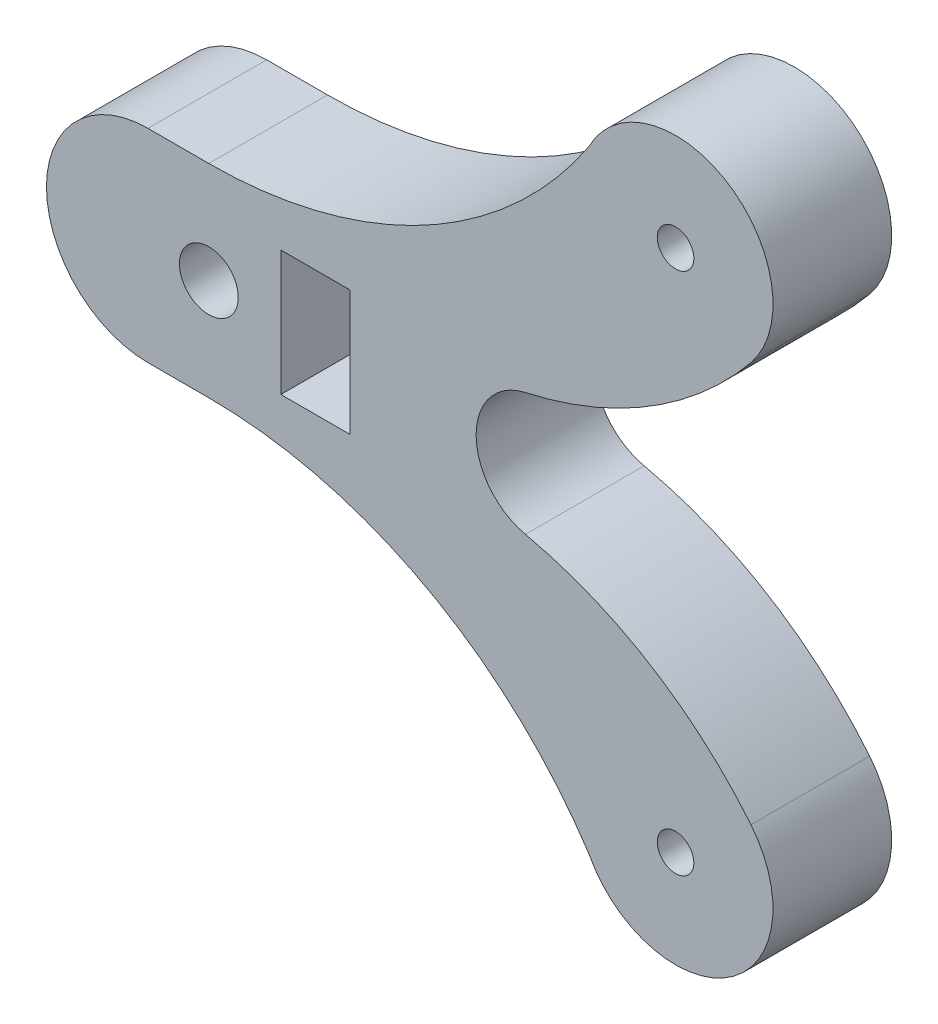
ISO-10303-21;
HEADER;
FILE_DESCRIPTION(('STEP AP214'),'2;1');
FILE_NAME('part.step','',(''),(''),'','','');
FILE_SCHEMA(('AUTOMOTIVE_DESIGN { 1 0 10303 214 1 1 1 1 }'));
ENDSEC;
DATA;
#1=APPLICATION_CONTEXT('core data for automotive mechanical design processes');
#2=APPLICATION_PROTOCOL_DEFINITION('international standard','automotive_design',2000,#1);
#3=PRODUCT_CONTEXT('',#1,'mechanical');
#4=PRODUCT('Part','Part','',(#3));
#5=PRODUCT_RELATED_PRODUCT_CATEGORY('part','',(#4));
#6=PRODUCT_DEFINITION_FORMATION('','',#4);
#7=PRODUCT_DEFINITION_CONTEXT('part definition',#1,'design');
#8=PRODUCT_DEFINITION('design','',#6,#7);
#9=PRODUCT_DEFINITION_SHAPE('','',#8);
#10=(LENGTH_UNIT() NAMED_UNIT(*) SI_UNIT(.MILLI.,.METRE.));
#11=(NAMED_UNIT(*) PLANE_ANGLE_UNIT() SI_UNIT($,.RADIAN.));
#12=(NAMED_UNIT(*) SI_UNIT($,.STERADIAN.) SOLID_ANGLE_UNIT());
#13=UNCERTAINTY_MEASURE_WITH_UNIT(LENGTH_MEASURE(1.E-05),#10,'distance_accuracy_value','');
#14=(GEOMETRIC_REPRESENTATION_CONTEXT(3) GLOBAL_UNCERTAINTY_ASSIGNED_CONTEXT((#13)) GLOBAL_UNIT_ASSIGNED_CONTEXT((#10,
#11,#12)) REPRESENTATION_CONTEXT('',''));
#15=CARTESIAN_POINT('',(0.,0.,0.));
#16=DIRECTION('',(0.,0.,1.));
#17=DIRECTION('',(1.,0.,0.));
#18=AXIS2_PLACEMENT_3D('',#15,#16,#17);
#19=CARTESIAN_POINT('',(588.919699582057,407.939803553498,5.85));
#20=DIRECTION('',(0.,0.,-1.));
#21=DIRECTION('',(-1.,0.,0.));
#22=AXIS2_PLACEMENT_3D('',#19,#20,#21);
#23=PLANE('',#22);
#24=CARTESIAN_POINT('',(588.919699582057,435.365819013464,5.85));
#25=DIRECTION('',(0.,0.,1.));
#26=DIRECTION('',(1.,0.,0.));
#27=AXIS2_PLACEMENT_3D('',#24,#25,#26);
#28=CIRCLE('',#27,1.44981300000002);
#29=CARTESIAN_POINT('',(590.369512582057,435.365819013464,5.85));
#30=VERTEX_POINT('',#29);
#31=EDGE_CURVE('E174',#30,#30,#28,.T.);
#32=ORIENTED_EDGE('',*,*,#31,.F.);
#33=EDGE_LOOP('',(#32));
#34=FACE_BOUND('',#33,.T.);
#35=CARTESIAN_POINT('',(611.919699582057,448.265819013464,5.85));
#36=DIRECTION('',(0.,0.,1.));
#37=DIRECTION('',(1.,0.,0.));
#38=AXIS2_PLACEMENT_3D('',#35,#36,#37);
#39=CIRCLE('',#38,0.900000000000007);
#40=CARTESIAN_POINT('',(612.819699582057,448.265819013464,5.85));
#41=VERTEX_POINT('',#40);
#42=EDGE_CURVE('E186',#41,#41,#39,.T.);
#43=ORIENTED_EDGE('',*,*,#42,.F.);
#44=EDGE_LOOP('',(#43));
#45=FACE_BOUND('',#44,.T.);
#46=CARTESIAN_POINT('',(588.919699582057,407.939803553498,5.85));
#47=DIRECTION('',(0.,0.,-1.));
#48=DIRECTION('',(-1.,0.,0.));
#49=AXIS2_PLACEMENT_3D('',#46,#47,#48);
#50=CIRCLE('',#49,22.4260154599657);
#51=CARTESIAN_POINT('',(588.919699582057,430.365819013464,5.85));
#52=VERTEX_POINT('',#51);
#53=CARTESIAN_POINT('',(607.649897060832,420.272924481175,5.85));
#54=VERTEX_POINT('',#53);
#55=EDGE_CURVE('E192',#52,#54,#50,.T.);
#56=ORIENTED_EDGE('',*,*,#55,.T.);
#57=CARTESIAN_POINT('',(611.919699582057,422.465819013464,5.85));
#58=DIRECTION('',(0.,0.,1.));
#59=DIRECTION('',(1.,0.,0.));
#60=AXIS2_PLACEMENT_3D('',#57,#58,#59);
#61=CIRCLE('',#60,4.79999999999999);
#62=CARTESIAN_POINT('',(615.634267587279,425.505882258625,5.85));
#63=VERTEX_POINT('',#62);
#64=EDGE_CURVE('E195',#54,#63,#61,.T.);
#65=ORIENTED_EDGE('',*,*,#64,.T.);
#66=CARTESIAN_POINT('',(600.219995385918,412.890589631222,5.85));
#67=DIRECTION('',(0.,0.,1.));
#68=DIRECTION('',(-1.,0.,0.));
#69=AXIS2_PLACEMENT_3D('',#66,#67,#68);
#70=CIRCLE('',#69,19.9184687055168);
#71=CARTESIAN_POINT('',(604.521800573852,432.338979479683,5.85));
#72=VERTEX_POINT('',#71);
#73=EDGE_CURVE('E198',#63,#72,#70,.T.);
#74=ORIENTED_EDGE('',*,*,#73,.T.);
#75=CARTESIAN_POINT('',(605.191309675167,435.365819013464,5.85));
#76=DIRECTION('',(0.,0.,-1.));
#77=DIRECTION('',(1.,0.,0.));
#78=AXIS2_PLACEMENT_3D('',#75,#76,#77);
#79=CIRCLE('',#78,3.09999999999995);
#80=CARTESIAN_POINT('',(604.521800573852,438.392658547244,5.85));
#81=VERTEX_POINT('',#80);
#82=EDGE_CURVE('E200',#72,#81,#79,.T.);
#83=ORIENTED_EDGE('',*,*,#82,.T.);
#84=CARTESIAN_POINT('',(600.219995385918,457.841048395705,5.85));
#85=DIRECTION('',(0.,0.,1.));
#86=DIRECTION('',(1.,0.,0.));
#87=AXIS2_PLACEMENT_3D('',#84,#85,#86);
#88=CIRCLE('',#87,19.9184687055169);
#89=CARTESIAN_POINT('',(615.634267587279,445.225755768303,5.85));
#90=VERTEX_POINT('',#89);
#91=EDGE_CURVE('E202',#81,#90,#88,.T.);
#92=ORIENTED_EDGE('',*,*,#91,.T.);
#93=CARTESIAN_POINT('',(611.919699582057,448.265819013464,5.85));
#94=DIRECTION('',(0.,0.,1.));
#95=DIRECTION('',(-1.,0.,0.));
#96=AXIS2_PLACEMENT_3D('',#93,#94,#95);
#97=CIRCLE('',#96,4.80000000000001);
#98=CARTESIAN_POINT('',(607.649897060832,450.458713545752,5.85));
#99=VERTEX_POINT('',#98);
#100=EDGE_CURVE('E204',#90,#99,#97,.T.);
#101=ORIENTED_EDGE('',*,*,#100,.T.);
#102=CARTESIAN_POINT('',(588.919699582057,462.79183447343,5.85));
#103=DIRECTION('',(0.,0.,-1.));
#104=DIRECTION('',(1.,0.,0.));
#105=AXIS2_PLACEMENT_3D('',#102,#103,#104);
#106=CIRCLE('',#105,22.4260154599657);
#107=CARTESIAN_POINT('',(588.919699582057,440.365819013464,5.85));
#108=VERTEX_POINT('',#107);
#109=EDGE_CURVE('E206',#99,#108,#106,.T.);
#110=ORIENTED_EDGE('',*,*,#109,.T.);
#111=DIRECTION('',(-1.,0.,0.));
#112=VECTOR('',#111,1.);
#113=CARTESIAN_POINT('',(588.919699582057,440.365819013464,5.85));
#114=LINE('',#113,#112);
#115=CARTESIAN_POINT('',(585.919699582057,440.365819013464,5.85));
#116=VERTEX_POINT('',#115);
#117=EDGE_CURVE('E208',#108,#116,#114,.T.);
#118=ORIENTED_EDGE('',*,*,#117,.T.);
#119=CARTESIAN_POINT('',(585.919699582057,435.365819013464,5.85));
#120=DIRECTION('',(0.,0.,1.));
#121=DIRECTION('',(1.,0.,0.));
#122=AXIS2_PLACEMENT_3D('',#119,#120,#121);
#123=CIRCLE('',#122,5.);
#124=CARTESIAN_POINT('',(585.919699582057,430.365819013464,5.85));
#125=VERTEX_POINT('',#124);
#126=EDGE_CURVE('E210',#116,#125,#123,.T.);
#127=ORIENTED_EDGE('',*,*,#126,.T.);
#128=DIRECTION('',(1.,0.,0.));
#129=VECTOR('',#128,1.);
#130=CARTESIAN_POINT('',(588.919699582057,430.365819013464,5.85));
#131=LINE('',#130,#129);
#132=EDGE_CURVE('E212',#125,#52,#131,.T.);
#133=ORIENTED_EDGE('',*,*,#132,.T.);
#134=EDGE_LOOP('',(#56,#65,#74,#83,#92,#101,#110,#118,#127,#133));
#135=FACE_BOUND('',#134,.T.);
#136=CARTESIAN_POINT('',(611.919699582057,422.465819013464,5.85));
#137=DIRECTION('',(0.,0.,1.));
#138=DIRECTION('',(1.,0.,0.));
#139=AXIS2_PLACEMENT_3D('',#136,#137,#138);
#140=CIRCLE('',#139,0.900000000000007);
#141=CARTESIAN_POINT('',(612.819699582057,422.465819013464,5.85));
#142=VERTEX_POINT('',#141);
#143=EDGE_CURVE('E180',#142,#142,#140,.T.);
#144=ORIENTED_EDGE('',*,*,#143,.F.);
#145=EDGE_LOOP('',(#144));
#146=FACE_BOUND('',#145,.T.);
#147=DIRECTION('',(0.,-1.,0.));
#148=VECTOR('',#147,1.);
#149=CARTESIAN_POINT('',(592.469512582057,432.283319013464,5.85));
#150=LINE('',#149,#148);
#151=CARTESIAN_POINT('',(592.469512582057,438.448319013464,5.85));
#152=VERTEX_POINT('',#151);
#153=CARTESIAN_POINT('',(592.469512582057,432.283319013464,5.85));
#154=VERTEX_POINT('',#153);
#155=EDGE_CURVE('E138',#152,#154,#150,.T.);
#156=ORIENTED_EDGE('',*,*,#155,.F.);
#157=DIRECTION('',(-1.,0.,0.));
#158=VECTOR('',#157,1.);
#159=CARTESIAN_POINT('',(592.469512582057,438.448319013464,5.85));
#160=LINE('',#159,#158);
#161=CARTESIAN_POINT('',(595.869523582057,438.448319013464,5.85));
#162=VERTEX_POINT('',#161);
#163=EDGE_CURVE('E160',#162,#152,#160,.T.);
#164=ORIENTED_EDGE('',*,*,#163,.F.);
#165=DIRECTION('',(0.,1.,0.));
#166=VECTOR('',#165,1.);
#167=CARTESIAN_POINT('',(595.869523582057,438.448319013464,5.85));
#168=LINE('',#167,#166);
#169=CARTESIAN_POINT('',(595.869523582057,432.283319013464,5.85));
#170=VERTEX_POINT('',#169);
#171=EDGE_CURVE('E158',#170,#162,#168,.T.);
#172=ORIENTED_EDGE('',*,*,#171,.F.);
#173=DIRECTION('',(1.,0.,0.));
#174=VECTOR('',#173,1.);
#175=CARTESIAN_POINT('',(595.869523582057,432.283319013464,5.85));
#176=LINE('',#175,#174);
#177=EDGE_CURVE('E146',#154,#170,#176,.T.);
#178=ORIENTED_EDGE('',*,*,#177,.F.);
#179=EDGE_LOOP('',(#156,#164,#172,#178));
#180=FACE_BOUND('',#179,.T.);
#181=ADVANCED_FACE('F37',(#34,#45,#135,#146,#180),#23,.F.);
#182=CARTESIAN_POINT('',(588.919699582057,407.939803553498,0.));
#183=DIRECTION('',(0.,0.,-1.));
#184=DIRECTION('',(-1.,0.,0.));
#185=AXIS2_PLACEMENT_3D('',#182,#183,#184);
#186=PLANE('',#185);
#187=CARTESIAN_POINT('',(588.919699582057,435.365819013464,0.));
#188=DIRECTION('',(0.,0.,1.));
#189=DIRECTION('',(1.,0.,0.));
#190=AXIS2_PLACEMENT_3D('',#187,#188,#189);
#191=CIRCLE('',#190,1.44981300000002);
#192=CARTESIAN_POINT('',(590.369512582057,435.365819013464,0.));
#193=VERTEX_POINT('',#192);
#194=EDGE_CURVE('E154',#193,#193,#191,.T.);
#195=ORIENTED_EDGE('',*,*,#194,.T.);
#196=EDGE_LOOP('',(#195));
#197=FACE_BOUND('',#196,.T.);
#198=CARTESIAN_POINT('',(611.919699582057,448.265819013464,0.));
#199=DIRECTION('',(0.,0.,1.));
#200=DIRECTION('',(1.,0.,0.));
#201=AXIS2_PLACEMENT_3D('',#198,#199,#200);
#202=CIRCLE('',#201,0.900000000000007);
#203=CARTESIAN_POINT('',(612.819699582057,448.265819013464,0.));
#204=VERTEX_POINT('',#203);
#205=EDGE_CURVE('E183',#204,#204,#202,.T.);
#206=ORIENTED_EDGE('',*,*,#205,.T.);
#207=EDGE_LOOP('',(#206));
#208=FACE_BOUND('',#207,.T.);
#209=CARTESIAN_POINT('',(588.919699582057,407.939803553498,0.));
#210=DIRECTION('',(0.,0.,-1.));
#211=DIRECTION('',(-1.,0.,0.));
#212=AXIS2_PLACEMENT_3D('',#209,#210,#211);
#213=CIRCLE('',#212,22.4260154599657);
#214=CARTESIAN_POINT('',(588.919699582057,430.365819013464,0.));
#215=VERTEX_POINT('',#214);
#216=CARTESIAN_POINT('',(607.649897060832,420.272924481175,0.));
#217=VERTEX_POINT('',#216);
#218=EDGE_CURVE('E189',#215,#217,#213,.T.);
#219=ORIENTED_EDGE('',*,*,#218,.F.);
#220=DIRECTION('',(1.,0.,0.));
#221=VECTOR('',#220,1.);
#222=CARTESIAN_POINT('',(588.919699582057,430.365819013464,0.));
#223=LINE('',#222,#221);
#224=CARTESIAN_POINT('',(585.919699582057,430.365819013464,0.));
#225=VERTEX_POINT('',#224);
#226=EDGE_CURVE('E196',#225,#215,#223,.T.);
#227=ORIENTED_EDGE('',*,*,#226,.F.);
#228=CARTESIAN_POINT('',(585.919699582057,435.365819013464,0.));
#229=DIRECTION('',(0.,0.,1.));
#230=DIRECTION('',(1.,0.,0.));
#231=AXIS2_PLACEMENT_3D('',#228,#229,#230);
#232=CIRCLE('',#231,5.);
#233=CARTESIAN_POINT('',(585.919699582057,440.365819013464,0.));
#234=VERTEX_POINT('',#233);
#235=EDGE_CURVE('E231',#234,#225,#232,.T.);
#236=ORIENTED_EDGE('',*,*,#235,.F.);
#237=DIRECTION('',(-1.,0.,0.));
#238=VECTOR('',#237,1.);
#239=CARTESIAN_POINT('',(588.919699582057,440.365819013464,0.));
#240=LINE('',#239,#238);
#241=CARTESIAN_POINT('',(588.919699582057,440.365819013464,0.));
#242=VERTEX_POINT('',#241);
#243=EDGE_CURVE('E229',#242,#234,#240,.T.);
#244=ORIENTED_EDGE('',*,*,#243,.F.);
#245=CARTESIAN_POINT('',(588.919699582057,462.79183447343,0.));
#246=DIRECTION('',(0.,0.,-1.));
#247=DIRECTION('',(1.,0.,0.));
#248=AXIS2_PLACEMENT_3D('',#245,#246,#247);
#249=CIRCLE('',#248,22.4260154599657);
#250=CARTESIAN_POINT('',(607.649897060832,450.458713545752,0.));
#251=VERTEX_POINT('',#250);
#252=EDGE_CURVE('E227',#251,#242,#249,.T.);
#253=ORIENTED_EDGE('',*,*,#252,.F.);
#254=CARTESIAN_POINT('',(611.919699582057,448.265819013464,0.));
#255=DIRECTION('',(0.,0.,1.));
#256=DIRECTION('',(-1.,0.,0.));
#257=AXIS2_PLACEMENT_3D('',#254,#255,#256);
#258=CIRCLE('',#257,4.80000000000001);
#259=CARTESIAN_POINT('',(615.634267587279,445.225755768303,0.));
#260=VERTEX_POINT('',#259);
#261=EDGE_CURVE('E225',#260,#251,#258,.T.);
#262=ORIENTED_EDGE('',*,*,#261,.F.);
#263=CARTESIAN_POINT('',(600.219995385918,457.841048395705,0.));
#264=DIRECTION('',(0.,0.,1.));
#265=DIRECTION('',(1.,0.,0.));
#266=AXIS2_PLACEMENT_3D('',#263,#264,#265);
#267=CIRCLE('',#266,19.9184687055169);
#268=CARTESIAN_POINT('',(604.521800573852,438.392658547244,0.));
#269=VERTEX_POINT('',#268);
#270=EDGE_CURVE('E223',#269,#260,#267,.T.);
#271=ORIENTED_EDGE('',*,*,#270,.F.);
#272=CARTESIAN_POINT('',(605.191309675167,435.365819013464,0.));
#273=DIRECTION('',(0.,0.,-1.));
#274=DIRECTION('',(1.,0.,0.));
#275=AXIS2_PLACEMENT_3D('',#272,#273,#274);
#276=CIRCLE('',#275,3.09999999999995);
#277=CARTESIAN_POINT('',(604.521800573852,432.338979479683,0.));
#278=VERTEX_POINT('',#277);
#279=EDGE_CURVE('E221',#278,#269,#276,.T.);
#280=ORIENTED_EDGE('',*,*,#279,.F.);
#281=CARTESIAN_POINT('',(600.219995385918,412.890589631222,0.));
#282=DIRECTION('',(0.,0.,1.));
#283=DIRECTION('',(-1.,0.,0.));
#284=AXIS2_PLACEMENT_3D('',#281,#282,#283);
#285=CIRCLE('',#284,19.9184687055168);
#286=CARTESIAN_POINT('',(615.634267587279,425.505882258625,0.));
#287=VERTEX_POINT('',#286);
#288=EDGE_CURVE('E219',#287,#278,#285,.T.);
#289=ORIENTED_EDGE('',*,*,#288,.F.);
#290=CARTESIAN_POINT('',(611.919699582057,422.465819013464,0.));
#291=DIRECTION('',(0.,0.,1.));
#292=DIRECTION('',(1.,0.,0.));
#293=AXIS2_PLACEMENT_3D('',#290,#291,#292);
#294=CIRCLE('',#293,4.79999999999999);
#295=EDGE_CURVE('E217',#217,#287,#294,.T.);
#296=ORIENTED_EDGE('',*,*,#295,.F.);
#297=EDGE_LOOP('',(#219,#227,#236,#244,#253,#262,#271,#280,#289,#296));
#298=FACE_BOUND('',#297,.T.);
#299=CARTESIAN_POINT('',(611.919699582057,422.465819013464,0.));
#300=DIRECTION('',(0.,0.,1.));
#301=DIRECTION('',(1.,0.,0.));
#302=AXIS2_PLACEMENT_3D('',#299,#300,#301);
#303=CIRCLE('',#302,0.900000000000007);
#304=CARTESIAN_POINT('',(612.819699582057,422.465819013464,0.));
#305=VERTEX_POINT('',#304);
#306=EDGE_CURVE('E177',#305,#305,#303,.T.);
#307=ORIENTED_EDGE('',*,*,#306,.T.);
#308=EDGE_LOOP('',(#307));
#309=FACE_BOUND('',#308,.T.);
#310=DIRECTION('',(-1.,0.,0.));
#311=VECTOR('',#310,1.);
#312=CARTESIAN_POINT('',(592.469512582057,438.448319013464,0.));
#313=LINE('',#312,#311);
#314=CARTESIAN_POINT('',(595.869523582057,438.448319013464,0.));
#315=VERTEX_POINT('',#314);
#316=CARTESIAN_POINT('',(592.469512582057,438.448319013464,0.));
#317=VERTEX_POINT('',#316);
#318=EDGE_CURVE('E147',#315,#317,#313,.T.);
#319=ORIENTED_EDGE('',*,*,#318,.T.);
#320=DIRECTION('',(0.,-1.,0.));
#321=VECTOR('',#320,1.);
#322=CARTESIAN_POINT('',(592.469512582057,432.283319013464,0.));
#323=LINE('',#322,#321);
#324=CARTESIAN_POINT('',(592.469512582057,432.283319013464,0.));
#325=VERTEX_POINT('',#324);
#326=EDGE_CURVE('E60',#317,#325,#323,.T.);
#327=ORIENTED_EDGE('',*,*,#326,.T.);
#328=DIRECTION('',(1.,0.,0.));
#329=VECTOR('',#328,1.);
#330=CARTESIAN_POINT('',(595.869523582057,432.283319013464,0.));
#331=LINE('',#330,#329);
#332=CARTESIAN_POINT('',(595.869523582057,432.283319013464,0.));
#333=VERTEX_POINT('',#332);
#334=EDGE_CURVE('E153',#325,#333,#331,.T.);
#335=ORIENTED_EDGE('',*,*,#334,.T.);
#336=DIRECTION('',(0.,1.,0.));
#337=VECTOR('',#336,1.);
#338=CARTESIAN_POINT('',(595.869523582057,438.448319013464,0.));
#339=LINE('',#338,#337);
#340=EDGE_CURVE('E166',#333,#315,#339,.T.);
#341=ORIENTED_EDGE('',*,*,#340,.T.);
#342=EDGE_LOOP('',(#319,#327,#335,#341));
#343=FACE_BOUND('',#342,.T.);
#344=ADVANCED_FACE('F267',(#197,#208,#298,#309,#343),#186,.T.);
#345=CARTESIAN_POINT('',(588.919699582057,407.939803553498,5.85));
#346=DIRECTION('',(0.,0.,-1.));
#347=DIRECTION('',(-1.,0.,0.));
#348=AXIS2_PLACEMENT_3D('',#345,#346,#347);
#349=CYLINDRICAL_SURFACE('',#348,22.4260154599657);
#350=ORIENTED_EDGE('',*,*,#218,.T.);
#351=DIRECTION('',(0.,0.,-1.));
#352=VECTOR('',#351,1.);
#353=CARTESIAN_POINT('',(607.649897060832,420.272924481175,5.85));
#354=LINE('',#353,#352);
#355=EDGE_CURVE('E11',#54,#217,#354,.T.);
#356=ORIENTED_EDGE('',*,*,#355,.F.);
#357=ORIENTED_EDGE('',*,*,#55,.F.);
#358=DIRECTION('',(0.,0.,-1.));
#359=VECTOR('',#358,1.);
#360=CARTESIAN_POINT('',(588.919699582057,430.365819013464,5.85));
#361=LINE('',#360,#359);
#362=EDGE_CURVE('E214',#52,#215,#361,.T.);
#363=ORIENTED_EDGE('',*,*,#362,.T.);
#364=EDGE_LOOP('',(#350,#356,#357,#363));
#365=FACE_BOUND('',#364,.T.);
#366=ADVANCED_FACE('F39',(#365),#349,.F.);
#367=CARTESIAN_POINT('',(611.919699582057,422.465819013464,5.85));
#368=DIRECTION('',(0.,0.,-1.));
#369=DIRECTION('',(-1.,0.,0.));
#370=AXIS2_PLACEMENT_3D('',#367,#368,#369);
#371=CYLINDRICAL_SURFACE('',#370,4.79999999999999);
#372=ORIENTED_EDGE('',*,*,#295,.T.);
#373=DIRECTION('',(0.,0.,-1.));
#374=VECTOR('',#373,1.);
#375=CARTESIAN_POINT('',(615.634267587279,425.505882258625,5.85));
#376=LINE('',#375,#374);
#377=EDGE_CURVE('E45',#63,#287,#376,.T.);
#378=ORIENTED_EDGE('',*,*,#377,.F.);
#379=ORIENTED_EDGE('',*,*,#64,.F.);
#380=ORIENTED_EDGE('',*,*,#355,.T.);
#381=EDGE_LOOP('',(#372,#378,#379,#380));
#382=FACE_BOUND('',#381,.T.);
#383=ADVANCED_FACE('F285',(#382),#371,.T.);
#384=CARTESIAN_POINT('',(600.219995385918,412.890589631222,5.85));
#385=DIRECTION('',(0.,0.,-1.));
#386=DIRECTION('',(-1.,0.,0.));
#387=AXIS2_PLACEMENT_3D('',#384,#385,#386);
#388=CYLINDRICAL_SURFACE('',#387,19.9184687055168);
#389=ORIENTED_EDGE('',*,*,#288,.T.);
#390=DIRECTION('',(0.,0.,-1.));
#391=VECTOR('',#390,1.);
#392=CARTESIAN_POINT('',(604.521800573852,432.338979479683,5.85));
#393=LINE('',#392,#391);
#394=EDGE_CURVE('E254',#72,#278,#393,.T.);
#395=ORIENTED_EDGE('',*,*,#394,.F.);
#396=ORIENTED_EDGE('',*,*,#73,.F.);
#397=ORIENTED_EDGE('',*,*,#377,.T.);
#398=EDGE_LOOP('',(#389,#395,#396,#397));
#399=FACE_BOUND('',#398,.T.);
#400=ADVANCED_FACE('F261',(#399),#388,.T.);
#401=CARTESIAN_POINT('',(605.191309675167,435.365819013464,5.85));
#402=DIRECTION('',(0.,0.,-1.));
#403=DIRECTION('',(-1.,0.,0.));
#404=AXIS2_PLACEMENT_3D('',#401,#402,#403);
#405=CYLINDRICAL_SURFACE('',#404,3.09999999999995);
#406=ORIENTED_EDGE('',*,*,#279,.T.);
#407=DIRECTION('',(0.,0.,-1.));
#408=VECTOR('',#407,1.);
#409=CARTESIAN_POINT('',(604.521800573852,438.392658547244,5.85));
#410=LINE('',#409,#408);
#411=EDGE_CURVE('E251',#81,#269,#410,.T.);
#412=ORIENTED_EDGE('',*,*,#411,.F.);
#413=ORIENTED_EDGE('',*,*,#82,.F.);
#414=ORIENTED_EDGE('',*,*,#394,.T.);
#415=EDGE_LOOP('',(#406,#412,#413,#414));
#416=FACE_BOUND('',#415,.T.);
#417=ADVANCED_FACE('F273',(#416),#405,.F.);
#418=CARTESIAN_POINT('',(600.219995385918,457.841048395705,5.85));
#419=DIRECTION('',(0.,0.,-1.));
#420=DIRECTION('',(-1.,0.,0.));
#421=AXIS2_PLACEMENT_3D('',#418,#419,#420);
#422=CYLINDRICAL_SURFACE('',#421,19.9184687055169);
#423=ORIENTED_EDGE('',*,*,#270,.T.);
#424=DIRECTION('',(0.,0.,-1.));
#425=VECTOR('',#424,1.);
#426=CARTESIAN_POINT('',(615.634267587279,445.225755768303,5.85));
#427=LINE('',#426,#425);
#428=EDGE_CURVE('E248',#90,#260,#427,.T.);
#429=ORIENTED_EDGE('',*,*,#428,.F.);
#430=ORIENTED_EDGE('',*,*,#91,.F.);
#431=ORIENTED_EDGE('',*,*,#411,.T.);
#432=EDGE_LOOP('',(#423,#429,#430,#431));
#433=FACE_BOUND('',#432,.T.);
#434=ADVANCED_FACE('F277',(#433),#422,.T.);
#435=CARTESIAN_POINT('',(611.919699582057,448.265819013464,5.85));
#436=DIRECTION('',(0.,0.,-1.));
#437=DIRECTION('',(-1.,0.,0.));
#438=AXIS2_PLACEMENT_3D('',#435,#436,#437);
#439=CYLINDRICAL_SURFACE('',#438,4.80000000000001);
#440=ORIENTED_EDGE('',*,*,#261,.T.);
#441=DIRECTION('',(0.,0.,-1.));
#442=VECTOR('',#441,1.);
#443=CARTESIAN_POINT('',(607.649897060832,450.458713545752,5.85));
#444=LINE('',#443,#442);
#445=EDGE_CURVE('E245',#99,#251,#444,.T.);
#446=ORIENTED_EDGE('',*,*,#445,.F.);
#447=ORIENTED_EDGE('',*,*,#100,.F.);
#448=ORIENTED_EDGE('',*,*,#428,.T.);
#449=EDGE_LOOP('',(#440,#446,#447,#448));
#450=FACE_BOUND('',#449,.T.);
#451=ADVANCED_FACE('F308',(#450),#439,.T.);
#452=CARTESIAN_POINT('',(588.919699582057,462.79183447343,5.85));
#453=DIRECTION('',(0.,0.,-1.));
#454=DIRECTION('',(-1.,0.,0.));
#455=AXIS2_PLACEMENT_3D('',#452,#453,#454);
#456=CYLINDRICAL_SURFACE('',#455,22.4260154599657);
#457=ORIENTED_EDGE('',*,*,#252,.T.);
#458=DIRECTION('',(0.,0.,-1.));
#459=VECTOR('',#458,1.);
#460=CARTESIAN_POINT('',(588.919699582057,440.365819013464,5.85));
#461=LINE('',#460,#459);
#462=EDGE_CURVE('E242',#108,#242,#461,.T.);
#463=ORIENTED_EDGE('',*,*,#462,.F.);
#464=ORIENTED_EDGE('',*,*,#109,.F.);
#465=ORIENTED_EDGE('',*,*,#445,.T.);
#466=EDGE_LOOP('',(#457,#463,#464,#465));
#467=FACE_BOUND('',#466,.T.);
#468=ADVANCED_FACE('F305',(#467),#456,.F.);
#469=CARTESIAN_POINT('',(588.919699582057,440.365819013464,5.85));
#470=DIRECTION('',(0.,-1.,0.));
#471=DIRECTION('',(0.,0.,-1.));
#472=AXIS2_PLACEMENT_3D('',#469,#470,#471);
#473=PLANE('',#472);
#474=ORIENTED_EDGE('',*,*,#243,.T.);
#475=DIRECTION('',(0.,0.,-1.));
#476=VECTOR('',#475,1.);
#477=CARTESIAN_POINT('',(585.919699582057,440.365819013464,5.85));
#478=LINE('',#477,#476);
#479=EDGE_CURVE('E239',#116,#234,#478,.T.);
#480=ORIENTED_EDGE('',*,*,#479,.F.);
#481=ORIENTED_EDGE('',*,*,#117,.F.);
#482=ORIENTED_EDGE('',*,*,#462,.T.);
#483=EDGE_LOOP('',(#474,#480,#481,#482));
#484=FACE_BOUND('',#483,.T.);
#485=ADVANCED_FACE('F301',(#484),#473,.F.);
#486=CARTESIAN_POINT('',(585.919699582057,435.365819013464,5.85));
#487=DIRECTION('',(0.,0.,-1.));
#488=DIRECTION('',(-1.,0.,0.));
#489=AXIS2_PLACEMENT_3D('',#486,#487,#488);
#490=CYLINDRICAL_SURFACE('',#489,5.);
#491=ORIENTED_EDGE('',*,*,#235,.T.);
#492=DIRECTION('',(0.,0.,-1.));
#493=VECTOR('',#492,1.);
#494=CARTESIAN_POINT('',(585.919699582057,430.365819013464,5.85));
#495=LINE('',#494,#493);
#496=EDGE_CURVE('E236',#125,#225,#495,.T.);
#497=ORIENTED_EDGE('',*,*,#496,.F.);
#498=ORIENTED_EDGE('',*,*,#126,.F.);
#499=ORIENTED_EDGE('',*,*,#479,.T.);
#500=EDGE_LOOP('',(#491,#497,#498,#499));
#501=FACE_BOUND('',#500,.T.);
#502=ADVANCED_FACE('F297',(#501),#490,.T.);
#503=CARTESIAN_POINT('',(588.919699582057,430.365819013464,5.85));
#504=DIRECTION('',(0.,1.,0.));
#505=DIRECTION('',(0.,0.,1.));
#506=AXIS2_PLACEMENT_3D('',#503,#504,#505);
#507=PLANE('',#506);
#508=ORIENTED_EDGE('',*,*,#226,.T.);
#509=ORIENTED_EDGE('',*,*,#362,.F.);
#510=ORIENTED_EDGE('',*,*,#132,.F.);
#511=ORIENTED_EDGE('',*,*,#496,.T.);
#512=EDGE_LOOP('',(#508,#509,#510,#511));
#513=FACE_BOUND('',#512,.T.);
#514=ADVANCED_FACE('F292',(#513),#507,.F.);
#515=CARTESIAN_POINT('',(611.919699582057,448.265819013464,5.85));
#516=DIRECTION('',(0.,0.,-1.));
#517=DIRECTION('',(-1.,0.,0.));
#518=AXIS2_PLACEMENT_3D('',#515,#516,#517);
#519=CYLINDRICAL_SURFACE('',#518,0.900000000000007);
#520=ORIENTED_EDGE('',*,*,#42,.T.);
#521=EDGE_LOOP('',(#520));
#522=FACE_BOUND('',#521,.T.);
#523=ORIENTED_EDGE('',*,*,#205,.F.);
#524=EDGE_LOOP('',(#523));
#525=FACE_BOUND('',#524,.T.);
#526=ADVANCED_FACE('F328',(#522,#525),#519,.F.);
#527=CARTESIAN_POINT('',(611.919699582057,422.465819013464,5.85));
#528=DIRECTION('',(0.,0.,-1.));
#529=DIRECTION('',(-1.,0.,0.));
#530=AXIS2_PLACEMENT_3D('',#527,#528,#529);
#531=CYLINDRICAL_SURFACE('',#530,0.900000000000007);
#532=ORIENTED_EDGE('',*,*,#143,.T.);
#533=EDGE_LOOP('',(#532));
#534=FACE_BOUND('',#533,.T.);
#535=ORIENTED_EDGE('',*,*,#306,.F.);
#536=EDGE_LOOP('',(#535));
#537=FACE_BOUND('',#536,.T.);
#538=ADVANCED_FACE('F354',(#534,#537),#531,.F.);
#539=CARTESIAN_POINT('',(588.919699582057,435.365819013464,5.85));
#540=DIRECTION('',(0.,0.,-1.));
#541=DIRECTION('',(-1.,0.,0.));
#542=AXIS2_PLACEMENT_3D('',#539,#540,#541);
#543=CYLINDRICAL_SURFACE('',#542,1.44981300000002);
#544=ORIENTED_EDGE('',*,*,#31,.T.);
#545=EDGE_LOOP('',(#544));
#546=FACE_BOUND('',#545,.T.);
#547=ORIENTED_EDGE('',*,*,#194,.F.);
#548=EDGE_LOOP('',(#547));
#549=FACE_BOUND('',#548,.T.);
#550=ADVANCED_FACE('F361',(#546,#549),#543,.F.);
#551=CARTESIAN_POINT('',(592.469512582057,432.283319013464,5.85));
#552=DIRECTION('',(1.,0.,0.));
#553=DIRECTION('',(0.,0.,-1.));
#554=AXIS2_PLACEMENT_3D('',#551,#552,#553);
#555=PLANE('',#554);
#556=ORIENTED_EDGE('',*,*,#326,.F.);
#557=DIRECTION('',(0.,0.,-1.));
#558=VECTOR('',#557,1.);
#559=CARTESIAN_POINT('',(592.469512582057,438.448319013464,5.85));
#560=LINE('',#559,#558);
#561=EDGE_CURVE('E142',#152,#317,#560,.T.);
#562=ORIENTED_EDGE('',*,*,#561,.F.);
#563=ORIENTED_EDGE('',*,*,#155,.T.);
#564=DIRECTION('',(0.,0.,-1.));
#565=VECTOR('',#564,1.);
#566=CARTESIAN_POINT('',(592.469512582057,432.283319013464,5.85));
#567=LINE('',#566,#565);
#568=EDGE_CURVE('E141',#154,#325,#567,.T.);
#569=ORIENTED_EDGE('',*,*,#568,.T.);
#570=EDGE_LOOP('',(#556,#562,#563,#569));
#571=FACE_BOUND('',#570,.T.);
#572=ADVANCED_FACE('F140',(#571),#555,.T.);
#573=CARTESIAN_POINT('',(595.869523582057,432.283319013464,5.85));
#574=DIRECTION('',(0.,1.,0.));
#575=DIRECTION('',(0.,0.,1.));
#576=AXIS2_PLACEMENT_3D('',#573,#574,#575);
#577=PLANE('',#576);
#578=ORIENTED_EDGE('',*,*,#334,.F.);
#579=ORIENTED_EDGE('',*,*,#568,.F.);
#580=ORIENTED_EDGE('',*,*,#177,.T.);
#581=DIRECTION('',(0.,0.,-1.));
#582=VECTOR('',#581,1.);
#583=CARTESIAN_POINT('',(595.869523582057,432.283319013464,5.85));
#584=LINE('',#583,#582);
#585=EDGE_CURVE('E155',#170,#333,#584,.T.);
#586=ORIENTED_EDGE('',*,*,#585,.T.);
#587=EDGE_LOOP('',(#578,#579,#580,#586));
#588=FACE_BOUND('',#587,.T.);
#589=ADVANCED_FACE('F150',(#588),#577,.T.);
#590=CARTESIAN_POINT('',(595.869523582057,438.448319013464,5.85));
#591=DIRECTION('',(-1.,0.,0.));
#592=DIRECTION('',(0.,0.,1.));
#593=AXIS2_PLACEMENT_3D('',#590,#591,#592);
#594=PLANE('',#593);
#595=ORIENTED_EDGE('',*,*,#340,.F.);
#596=ORIENTED_EDGE('',*,*,#585,.F.);
#597=ORIENTED_EDGE('',*,*,#171,.T.);
#598=DIRECTION('',(0.,0.,-1.));
#599=VECTOR('',#598,1.);
#600=CARTESIAN_POINT('',(595.869523582057,438.448319013464,5.85));
#601=LINE('',#600,#599);
#602=EDGE_CURVE('E52',#162,#315,#601,.T.);
#603=ORIENTED_EDGE('',*,*,#602,.T.);
#604=EDGE_LOOP('',(#595,#596,#597,#603));
#605=FACE_BOUND('',#604,.T.);
#606=ADVANCED_FACE('F381',(#605),#594,.T.);
#607=CARTESIAN_POINT('',(592.469512582057,438.448319013464,5.85));
#608=DIRECTION('',(0.,-1.,0.));
#609=DIRECTION('',(0.,0.,-1.));
#610=AXIS2_PLACEMENT_3D('',#607,#608,#609);
#611=PLANE('',#610);
#612=ORIENTED_EDGE('',*,*,#318,.F.);
#613=ORIENTED_EDGE('',*,*,#602,.F.);
#614=ORIENTED_EDGE('',*,*,#163,.T.);
#615=ORIENTED_EDGE('',*,*,#561,.T.);
#616=EDGE_LOOP('',(#612,#613,#614,#615));
#617=FACE_BOUND('',#616,.T.);
#618=ADVANCED_FACE('F388',(#617),#611,.T.);
#619=CLOSED_SHELL('',(#181,#344,#366,#383,#400,#417,#434,#451,#468,#485,#502,#514,#526,#538,
#550,#572,#589,#606,#618));
#620=MANIFOLD_SOLID_BREP('B2',#619);
#621=ADVANCED_BREP_SHAPE_REPRESENTATION('',(#18,#620),#14);
#622=SHAPE_DEFINITION_REPRESENTATION(#9,#621);
ENDSEC;
END-ISO-10303-21;
